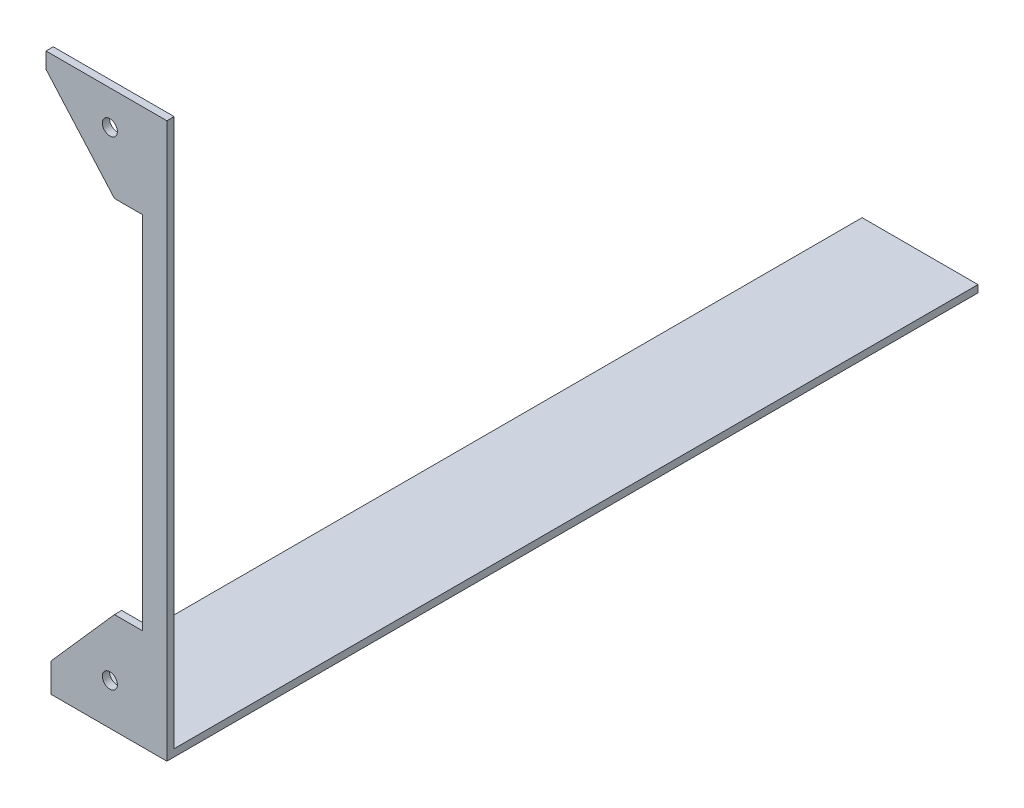
ISO-10303-21;
HEADER;
FILE_DESCRIPTION(('STEP AP214'),'2;1');
FILE_NAME('part.step','',(''),(''),'','','');
FILE_SCHEMA(('AUTOMOTIVE_DESIGN { 1 0 10303 214 1 1 1 1 }'));
ENDSEC;
DATA;
#1=APPLICATION_CONTEXT('core data for automotive mechanical design processes');
#2=APPLICATION_PROTOCOL_DEFINITION('international standard','automotive_design',2000,#1);
#3=PRODUCT_CONTEXT('',#1,'mechanical');
#4=PRODUCT('Part','Part','',(#3));
#5=PRODUCT_RELATED_PRODUCT_CATEGORY('part','',(#4));
#6=PRODUCT_DEFINITION_FORMATION('','',#4);
#7=PRODUCT_DEFINITION_CONTEXT('part definition',#1,'design');
#8=PRODUCT_DEFINITION('design','',#6,#7);
#9=PRODUCT_DEFINITION_SHAPE('','',#8);
#10=(LENGTH_UNIT() NAMED_UNIT(*) SI_UNIT(.MILLI.,.METRE.));
#11=(NAMED_UNIT(*) PLANE_ANGLE_UNIT() SI_UNIT($,.RADIAN.));
#12=(NAMED_UNIT(*) SI_UNIT($,.STERADIAN.) SOLID_ANGLE_UNIT());
#13=UNCERTAINTY_MEASURE_WITH_UNIT(LENGTH_MEASURE(1.E-05),#10,'distance_accuracy_value','');
#14=(GEOMETRIC_REPRESENTATION_CONTEXT(3) GLOBAL_UNCERTAINTY_ASSIGNED_CONTEXT((#13)) GLOBAL_UNIT_ASSIGNED_CONTEXT((#10,
#11,#12)) REPRESENTATION_CONTEXT('',''));
#15=CARTESIAN_POINT('',(0.,0.,0.));
#16=DIRECTION('',(0.,0.,1.));
#17=DIRECTION('',(1.,0.,0.));
#18=AXIS2_PLACEMENT_3D('',#15,#16,#17);
#19=CARTESIAN_POINT('',(-16.6361867704281,14.6789883268482,1.5875));
#20=DIRECTION('',(0.749837855365091,-0.661621637086848,0.));
#21=DIRECTION('',(0.661621637086848,0.749837855365091,0.));
#22=AXIS2_PLACEMENT_3D('',#19,#20,#21);
#23=PLANE('',#22);
#24=DIRECTION('',(-0.661621637086849,-0.749837855365093,0.));
#25=VECTOR('',#24,1.);
#26=CARTESIAN_POINT('',(-16.6361867704281,14.6789883268482,0.));
#27=LINE('',#26,#25);
#28=CARTESIAN_POINT('',(-11.5,20.5,0.));
#29=VERTEX_POINT('',#28);
#30=CARTESIAN_POINT('',(-25.4000000000002,4.74666666666666,0.));
#31=VERTEX_POINT('',#30);
#32=EDGE_CURVE('E151',#29,#31,#27,.T.);
#33=ORIENTED_EDGE('',*,*,#32,.T.);
#34=DIRECTION('',(0.,0.,-1.));
#35=VECTOR('',#34,1.);
#36=CARTESIAN_POINT('',(-25.4000000000002,4.74666666666666,1.5875));
#37=LINE('',#36,#35);
#38=CARTESIAN_POINT('',(-25.4000000000002,4.74666666666666,1.5875));
#39=VERTEX_POINT('',#38);
#40=EDGE_CURVE('E11',#39,#31,#37,.T.);
#41=ORIENTED_EDGE('',*,*,#40,.F.);
#42=DIRECTION('',(-0.661621637086849,-0.749837855365093,0.));
#43=VECTOR('',#42,1.);
#44=CARTESIAN_POINT('',(-16.6361867704281,14.6789883268482,1.5875));
#45=LINE('',#44,#43);
#46=CARTESIAN_POINT('',(-11.5,20.5,1.5875));
#47=VERTEX_POINT('',#46);
#48=EDGE_CURVE('E212',#47,#39,#45,.T.);
#49=ORIENTED_EDGE('',*,*,#48,.F.);
#50=DIRECTION('',(0.,0.,-1.));
#51=VECTOR('',#50,1.);
#52=CARTESIAN_POINT('',(-11.5,20.5,1.5875));
#53=LINE('',#52,#51);
#54=EDGE_CURVE('E140',#47,#29,#53,.T.);
#55=ORIENTED_EDGE('',*,*,#54,.T.);
#56=EDGE_LOOP('',(#33,#41,#49,#55));
#57=FACE_BOUND('',#56,.T.);
#58=ADVANCED_FACE('F39',(#57),#23,.F.);
#59=CARTESIAN_POINT('',(-25.4000000000002,0.,1.5875));
#60=DIRECTION('',(1.,0.,0.));
#61=DIRECTION('',(0.,1.,0.));
#62=AXIS2_PLACEMENT_3D('',#59,#60,#61);
#63=PLANE('',#62);
#64=DIRECTION('',(0.,-1.,0.));
#65=VECTOR('',#64,1.);
#66=CARTESIAN_POINT('',(-25.4000000000002,0.,0.));
#67=LINE('',#66,#65);
#68=CARTESIAN_POINT('',(-25.4000000000002,0.,0.));
#69=VERTEX_POINT('',#68);
#70=EDGE_CURVE('E154',#31,#69,#67,.T.);
#71=ORIENTED_EDGE('',*,*,#70,.T.);
#72=DIRECTION('',(0.,0.,1.));
#73=VECTOR('',#72,1.);
#74=CARTESIAN_POINT('',(-25.4000000000002,0.,-176.2125));
#75=LINE('',#74,#73);
#76=CARTESIAN_POINT('',(-25.4000000000002,0.,-176.2125));
#77=VERTEX_POINT('',#76);
#78=EDGE_CURVE('E224',#77,#69,#75,.T.);
#79=ORIENTED_EDGE('',*,*,#78,.F.);
#80=DIRECTION('',(0.,1.,0.));
#81=VECTOR('',#80,1.);
#82=CARTESIAN_POINT('',(-25.4000000000002,-1.5875,-176.2125));
#83=LINE('',#82,#81);
#84=CARTESIAN_POINT('',(-25.4000000000002,-1.5875,-176.2125));
#85=VERTEX_POINT('',#84);
#86=EDGE_CURVE('E148',#85,#77,#83,.T.);
#87=ORIENTED_EDGE('',*,*,#86,.F.);
#88=DIRECTION('',(0.,0.,1.));
#89=VECTOR('',#88,1.);
#90=CARTESIAN_POINT('',(-25.4000000000002,-1.5875,-176.2125));
#91=LINE('',#90,#89);
#92=CARTESIAN_POINT('',(-25.4000000000002,-1.5875,1.5875));
#93=VERTEX_POINT('',#92);
#94=EDGE_CURVE('E221',#85,#93,#91,.T.);
#95=ORIENTED_EDGE('',*,*,#94,.T.);
#96=DIRECTION('',(0.,-1.,0.));
#97=VECTOR('',#96,1.);
#98=CARTESIAN_POINT('',(-25.4000000000002,0.,1.5875));
#99=LINE('',#98,#97);
#100=EDGE_CURVE('E103',#39,#93,#99,.T.);
#101=ORIENTED_EDGE('',*,*,#100,.F.);
#102=ORIENTED_EDGE('',*,*,#40,.T.);
#103=EDGE_LOOP('',(#71,#79,#87,#95,#101,#102));
#104=FACE_BOUND('',#103,.T.);
#105=ADVANCED_FACE('F252',(#104),#63,.F.);
#106=CARTESIAN_POINT('',(0.,0.,1.5875));
#107=DIRECTION('',(1.,0.,0.));
#108=DIRECTION('',(0.,1.,0.));
#109=AXIS2_PLACEMENT_3D('',#106,#107,#108);
#110=PLANE('',#109);
#111=DIRECTION('',(0.,-1.,0.));
#112=VECTOR('',#111,1.);
#113=CARTESIAN_POINT('',(0.,0.,0.));
#114=LINE('',#113,#112);
#115=CARTESIAN_POINT('',(0.,120.,0.));
#116=VERTEX_POINT('',#115);
#117=CARTESIAN_POINT('',(0.,0.,0.));
#118=VERTEX_POINT('',#117);
#119=EDGE_CURVE('E160',#116,#118,#114,.T.);
#120=ORIENTED_EDGE('',*,*,#119,.F.);
#121=DIRECTION('',(0.,0.,-1.));
#122=VECTOR('',#121,1.);
#123=CARTESIAN_POINT('',(0.,120.,1.5875));
#124=LINE('',#123,#122);
#125=CARTESIAN_POINT('',(0.,120.,1.5875));
#126=VERTEX_POINT('',#125);
#127=EDGE_CURVE('E48',#126,#116,#124,.T.);
#128=ORIENTED_EDGE('',*,*,#127,.F.);
#129=DIRECTION('',(0.,-1.,0.));
#130=VECTOR('',#129,1.);
#131=CARTESIAN_POINT('',(0.,0.,1.5875));
#132=LINE('',#131,#130);
#133=CARTESIAN_POINT('',(0.,-1.5875,1.5875));
#134=VERTEX_POINT('',#133);
#135=EDGE_CURVE('E206',#126,#134,#132,.T.);
#136=ORIENTED_EDGE('',*,*,#135,.T.);
#137=DIRECTION('',(0.,0.,-1.));
#138=VECTOR('',#137,1.);
#139=CARTESIAN_POINT('',(0.,-1.5875,1.5875));
#140=LINE('',#139,#138);
#141=CARTESIAN_POINT('',(0.,-1.5875,-176.2125));
#142=VERTEX_POINT('',#141);
#143=EDGE_CURVE('E235',#134,#142,#140,.T.);
#144=ORIENTED_EDGE('',*,*,#143,.T.);
#145=DIRECTION('',(0.,1.,0.));
#146=VECTOR('',#145,1.);
#147=CARTESIAN_POINT('',(0.,-1.5875,-176.2125));
#148=LINE('',#147,#146);
#149=CARTESIAN_POINT('',(0.,0.,-176.2125));
#150=VERTEX_POINT('',#149);
#151=EDGE_CURVE('E219',#142,#150,#148,.T.);
#152=ORIENTED_EDGE('',*,*,#151,.T.);
#153=DIRECTION('',(0.,0.,-1.));
#154=VECTOR('',#153,1.);
#155=CARTESIAN_POINT('',(0.,0.,1.5875));
#156=LINE('',#155,#154);
#157=EDGE_CURVE('E195',#118,#150,#156,.T.);
#158=ORIENTED_EDGE('',*,*,#157,.F.);
#159=EDGE_LOOP('',(#120,#128,#136,#144,#152,#158));
#160=FACE_BOUND('',#159,.T.);
#161=ADVANCED_FACE('F192',(#160),#110,.T.);
#162=CARTESIAN_POINT('',(0.,120.,1.5875));
#163=DIRECTION('',(0.,1.,0.));
#164=DIRECTION('',(-1.,0.,0.));
#165=AXIS2_PLACEMENT_3D('',#162,#163,#164);
#166=PLANE('',#165);
#167=DIRECTION('',(1.00000000000001,0.,0.));
#168=VECTOR('',#167,1.);
#169=CARTESIAN_POINT('',(0.,120.,0.));
#170=LINE('',#169,#168);
#171=CARTESIAN_POINT('',(-26.5000000000002,120.,0.));
#172=VERTEX_POINT('',#171);
#173=EDGE_CURVE('E163',#172,#116,#170,.T.);
#174=ORIENTED_EDGE('',*,*,#173,.F.);
#175=DIRECTION('',(0.,0.,-1.));
#176=VECTOR('',#175,1.);
#177=CARTESIAN_POINT('',(-26.5000000000002,120.,1.5875));
#178=LINE('',#177,#176);
#179=CARTESIAN_POINT('',(-26.5000000000002,120.,1.5875));
#180=VERTEX_POINT('',#179);
#181=EDGE_CURVE('E180',#180,#172,#178,.T.);
#182=ORIENTED_EDGE('',*,*,#181,.F.);
#183=DIRECTION('',(1.00000000000001,0.,0.));
#184=VECTOR('',#183,1.);
#185=CARTESIAN_POINT('',(0.,120.,1.5875));
#186=LINE('',#185,#184);
#187=EDGE_CURVE('E187',#180,#126,#186,.T.);
#188=ORIENTED_EDGE('',*,*,#187,.T.);
#189=ORIENTED_EDGE('',*,*,#127,.T.);
#190=EDGE_LOOP('',(#174,#182,#188,#189));
#191=FACE_BOUND('',#190,.T.);
#192=ADVANCED_FACE('F185',(#191),#166,.T.);
#193=CARTESIAN_POINT('',(-26.5000000000003,0.,1.5875));
#194=DIRECTION('',(-1.,0.,0.));
#195=DIRECTION('',(0.,-1.,0.));
#196=AXIS2_PLACEMENT_3D('',#193,#194,#195);
#197=PLANE('',#196);
#198=DIRECTION('',(0.,1.,0.));
#199=VECTOR('',#198,1.);
#200=CARTESIAN_POINT('',(-26.5000000000003,0.,0.));
#201=LINE('',#200,#199);
#202=CARTESIAN_POINT('',(-26.5000000000002,116.5,0.));
#203=VERTEX_POINT('',#202);
#204=EDGE_CURVE('E166',#203,#172,#201,.T.);
#205=ORIENTED_EDGE('',*,*,#204,.F.);
#206=DIRECTION('',(0.,0.,-1.));
#207=VECTOR('',#206,1.);
#208=CARTESIAN_POINT('',(-26.5000000000002,116.5,1.5875));
#209=LINE('',#208,#207);
#210=CARTESIAN_POINT('',(-26.5000000000002,116.5,1.5875));
#211=VERTEX_POINT('',#210);
#212=EDGE_CURVE('E178',#211,#203,#209,.T.);
#213=ORIENTED_EDGE('',*,*,#212,.F.);
#214=DIRECTION('',(0.,1.,0.));
#215=VECTOR('',#214,1.);
#216=CARTESIAN_POINT('',(-26.5000000000003,0.,1.5875));
#217=LINE('',#216,#215);
#218=EDGE_CURVE('E204',#211,#180,#217,.T.);
#219=ORIENTED_EDGE('',*,*,#218,.T.);
#220=ORIENTED_EDGE('',*,*,#181,.T.);
#221=EDGE_LOOP('',(#205,#213,#219,#220));
#222=FACE_BOUND('',#221,.T.);
#223=ADVANCED_FACE('F202',(#222),#197,.T.);
#224=CARTESIAN_POINT('',(42.8968871595333,37.8501945525292,1.5875));
#225=DIRECTION('',(0.749837855365091,0.661621637086848,0.));
#226=DIRECTION('',(-0.661621637086848,0.749837855365091,0.));
#227=AXIS2_PLACEMENT_3D('',#224,#225,#226);
#228=PLANE('',#227);
#229=DIRECTION('',(0.661621637086849,-0.749837855365093,0.));
#230=VECTOR('',#229,1.);
#231=CARTESIAN_POINT('',(42.8968871595333,37.8501945525292,0.));
#232=LINE('',#231,#230);
#233=CARTESIAN_POINT('',(-11.5000000000001,99.5,0.));
#234=VERTEX_POINT('',#233);
#235=EDGE_CURVE('E169',#203,#234,#232,.T.);
#236=ORIENTED_EDGE('',*,*,#235,.T.);
#237=DIRECTION('',(0.,0.,-1.));
#238=VECTOR('',#237,1.);
#239=CARTESIAN_POINT('',(-11.5000000000001,99.5,1.5875));
#240=LINE('',#239,#238);
#241=CARTESIAN_POINT('',(-11.5000000000001,99.5,1.5875));
#242=VERTEX_POINT('',#241);
#243=EDGE_CURVE('E135',#242,#234,#240,.T.);
#244=ORIENTED_EDGE('',*,*,#243,.F.);
#245=DIRECTION('',(0.661621637086849,-0.749837855365093,0.));
#246=VECTOR('',#245,1.);
#247=CARTESIAN_POINT('',(42.8968871595333,37.8501945525292,1.5875));
#248=LINE('',#247,#246);
#249=EDGE_CURVE('E126',#211,#242,#248,.T.);
#250=ORIENTED_EDGE('',*,*,#249,.F.);
#251=ORIENTED_EDGE('',*,*,#212,.T.);
#252=EDGE_LOOP('',(#236,#244,#250,#251));
#253=FACE_BOUND('',#252,.T.);
#254=ADVANCED_FACE('F380',(#253),#228,.F.);
#255=CARTESIAN_POINT('',(0.,99.5,1.5875));
#256=DIRECTION('',(0.,1.,0.));
#257=DIRECTION('',(-1.,0.,0.));
#258=AXIS2_PLACEMENT_3D('',#255,#256,#257);
#259=PLANE('',#258);
#260=DIRECTION('',(1.00000000000001,0.,0.));
#261=VECTOR('',#260,1.);
#262=CARTESIAN_POINT('',(0.,99.5,0.));
#263=LINE('',#262,#261);
#264=CARTESIAN_POINT('',(-5.40000000000002,99.5,0.));
#265=VERTEX_POINT('',#264);
#266=EDGE_CURVE('E134',#234,#265,#263,.T.);
#267=ORIENTED_EDGE('',*,*,#266,.T.);
#268=DIRECTION('',(0.,0.,-1.));
#269=VECTOR('',#268,1.);
#270=CARTESIAN_POINT('',(-5.40000000000002,99.5,1.5875));
#271=LINE('',#270,#269);
#272=CARTESIAN_POINT('',(-5.40000000000002,99.5,1.5875));
#273=VERTEX_POINT('',#272);
#274=EDGE_CURVE('E131',#273,#265,#271,.T.);
#275=ORIENTED_EDGE('',*,*,#274,.F.);
#276=DIRECTION('',(1.00000000000001,0.,0.));
#277=VECTOR('',#276,1.);
#278=CARTESIAN_POINT('',(0.,99.5,1.5875));
#279=LINE('',#278,#277);
#280=EDGE_CURVE('E119',#242,#273,#279,.T.);
#281=ORIENTED_EDGE('',*,*,#280,.F.);
#282=ORIENTED_EDGE('',*,*,#243,.T.);
#283=EDGE_LOOP('',(#267,#275,#281,#282));
#284=FACE_BOUND('',#283,.T.);
#285=ADVANCED_FACE('F132',(#284),#259,.F.);
#286=CARTESIAN_POINT('',(-5.40000000000002,0.,1.5875));
#287=DIRECTION('',(1.,0.,0.));
#288=DIRECTION('',(0.,1.,0.));
#289=AXIS2_PLACEMENT_3D('',#286,#287,#288);
#290=PLANE('',#289);
#291=DIRECTION('',(0.,-1.,0.));
#292=VECTOR('',#291,1.);
#293=CARTESIAN_POINT('',(-5.40000000000002,0.,0.));
#294=LINE('',#293,#292);
#295=CARTESIAN_POINT('',(-5.40000000000002,20.5,0.));
#296=VERTEX_POINT('',#295);
#297=EDGE_CURVE('E89',#265,#296,#294,.T.);
#298=ORIENTED_EDGE('',*,*,#297,.T.);
#299=DIRECTION('',(0.,0.,-1.));
#300=VECTOR('',#299,1.);
#301=CARTESIAN_POINT('',(-5.40000000000002,20.5,1.5875));
#302=LINE('',#301,#300);
#303=CARTESIAN_POINT('',(-5.40000000000002,20.5,1.5875));
#304=VERTEX_POINT('',#303);
#305=EDGE_CURVE('E136',#304,#296,#302,.T.);
#306=ORIENTED_EDGE('',*,*,#305,.F.);
#307=DIRECTION('',(0.,-1.,0.));
#308=VECTOR('',#307,1.);
#309=CARTESIAN_POINT('',(-5.40000000000002,0.,1.5875));
#310=LINE('',#309,#308);
#311=EDGE_CURVE('E123',#273,#304,#310,.T.);
#312=ORIENTED_EDGE('',*,*,#311,.F.);
#313=ORIENTED_EDGE('',*,*,#274,.T.);
#314=EDGE_LOOP('',(#298,#306,#312,#313));
#315=FACE_BOUND('',#314,.T.);
#316=ADVANCED_FACE('F138',(#315),#290,.F.);
#317=CARTESIAN_POINT('',(-12.5000000000001,112.5,1.5875));
#318=DIRECTION('',(0.,0.,-1.));
#319=DIRECTION('',(-1.,0.,0.));
#320=AXIS2_PLACEMENT_3D('',#317,#318,#319);
#321=CYLINDRICAL_SURFACE('',#320,1.65);
#322=CARTESIAN_POINT('',(-12.5000000000001,112.5,1.5875));
#323=DIRECTION('',(0.,0.,1.00000000000001));
#324=DIRECTION('',(1.00000000000001,0.,0.));
#325=AXIS2_PLACEMENT_3D('',#322,#323,#324);
#326=CIRCLE('',#325,1.65);
#327=CARTESIAN_POINT('',(-10.8500000000001,112.5,1.5875));
#328=VERTEX_POINT('',#327);
#329=EDGE_CURVE('E214',#328,#328,#326,.T.);
#330=ORIENTED_EDGE('',*,*,#329,.T.);
#331=EDGE_LOOP('',(#330));
#332=FACE_BOUND('',#331,.T.);
#333=CARTESIAN_POINT('',(-12.5000000000001,112.5,0.));
#334=DIRECTION('',(0.,0.,1.00000000000001));
#335=DIRECTION('',(1.00000000000001,0.,0.));
#336=AXIS2_PLACEMENT_3D('',#333,#334,#335);
#337=CIRCLE('',#336,1.65);
#338=CARTESIAN_POINT('',(-10.8500000000001,112.5,0.));
#339=VERTEX_POINT('',#338);
#340=EDGE_CURVE('E147',#339,#339,#337,.T.);
#341=ORIENTED_EDGE('',*,*,#340,.F.);
#342=EDGE_LOOP('',(#341));
#343=FACE_BOUND('',#342,.T.);
#344=ADVANCED_FACE('F278',(#332,#343),#321,.F.);
#345=CARTESIAN_POINT('',(-12.5000000000001,7.49999999999999,1.5875));
#346=DIRECTION('',(0.,0.,-1.));
#347=DIRECTION('',(-1.,0.,0.));
#348=AXIS2_PLACEMENT_3D('',#345,#346,#347);
#349=CYLINDRICAL_SURFACE('',#348,1.65);
#350=CARTESIAN_POINT('',(-12.5000000000001,7.49999999999999,1.5875));
#351=DIRECTION('',(0.,0.,1.00000000000001));
#352=DIRECTION('',(1.00000000000001,0.,0.));
#353=AXIS2_PLACEMENT_3D('',#350,#351,#352);
#354=CIRCLE('',#353,1.65);
#355=CARTESIAN_POINT('',(-10.8500000000001,7.49999999999999,1.5875));
#356=VERTEX_POINT('',#355);
#357=EDGE_CURVE('E174',#356,#356,#354,.T.);
#358=ORIENTED_EDGE('',*,*,#357,.T.);
#359=EDGE_LOOP('',(#358));
#360=FACE_BOUND('',#359,.T.);
#361=CARTESIAN_POINT('',(-12.5000000000001,7.49999999999999,0.));
#362=DIRECTION('',(0.,0.,1.00000000000001));
#363=DIRECTION('',(1.00000000000001,0.,0.));
#364=AXIS2_PLACEMENT_3D('',#361,#362,#363);
#365=CIRCLE('',#364,1.65);
#366=CARTESIAN_POINT('',(-10.8500000000001,7.49999999999999,0.));
#367=VERTEX_POINT('',#366);
#368=EDGE_CURVE('E144',#367,#367,#365,.T.);
#369=ORIENTED_EDGE('',*,*,#368,.F.);
#370=EDGE_LOOP('',(#369));
#371=FACE_BOUND('',#370,.T.);
#372=ADVANCED_FACE('F41',(#360,#371),#349,.F.);
#373=CARTESIAN_POINT('',(0.,20.5,1.5875));
#374=DIRECTION('',(0.,-1.,0.));
#375=DIRECTION('',(1.,0.,0.));
#376=AXIS2_PLACEMENT_3D('',#373,#374,#375);
#377=PLANE('',#376);
#378=DIRECTION('',(-1.00000000000001,0.,0.));
#379=VECTOR('',#378,1.);
#380=CARTESIAN_POINT('',(0.,20.5,0.));
#381=LINE('',#380,#379);
#382=EDGE_CURVE('E95',#296,#29,#381,.T.);
#383=ORIENTED_EDGE('',*,*,#382,.T.);
#384=ORIENTED_EDGE('',*,*,#54,.F.);
#385=DIRECTION('',(-1.00000000000001,0.,0.));
#386=VECTOR('',#385,1.);
#387=CARTESIAN_POINT('',(0.,20.5,1.5875));
#388=LINE('',#387,#386);
#389=EDGE_CURVE('E56',#304,#47,#388,.T.);
#390=ORIENTED_EDGE('',*,*,#389,.F.);
#391=ORIENTED_EDGE('',*,*,#305,.T.);
#392=EDGE_LOOP('',(#383,#384,#390,#391));
#393=FACE_BOUND('',#392,.T.);
#394=ADVANCED_FACE('F268',(#393),#377,.F.);
#395=CARTESIAN_POINT('',(0.,0.,1.5875));
#396=DIRECTION('',(0.,0.,1.00000000000001));
#397=DIRECTION('',(1.00000000000001,0.,0.));
#398=AXIS2_PLACEMENT_3D('',#395,#396,#397);
#399=PLANE('',#398);
#400=ORIENTED_EDGE('',*,*,#357,.F.);
#401=EDGE_LOOP('',(#400));
#402=FACE_BOUND('',#401,.T.);
#403=ORIENTED_EDGE('',*,*,#329,.F.);
#404=EDGE_LOOP('',(#403));
#405=FACE_BOUND('',#404,.T.);
#406=ORIENTED_EDGE('',*,*,#48,.T.);
#407=ORIENTED_EDGE('',*,*,#100,.T.);
#408=DIRECTION('',(1.,0.,0.));
#409=VECTOR('',#408,1.);
#410=CARTESIAN_POINT('',(0.,-1.5875,1.5875));
#411=LINE('',#410,#409);
#412=EDGE_CURVE('E226',#93,#134,#411,.T.);
#413=ORIENTED_EDGE('',*,*,#412,.T.);
#414=ORIENTED_EDGE('',*,*,#135,.F.);
#415=ORIENTED_EDGE('',*,*,#187,.F.);
#416=ORIENTED_EDGE('',*,*,#218,.F.);
#417=ORIENTED_EDGE('',*,*,#249,.T.);
#418=ORIENTED_EDGE('',*,*,#280,.T.);
#419=ORIENTED_EDGE('',*,*,#311,.T.);
#420=ORIENTED_EDGE('',*,*,#389,.T.);
#421=EDGE_LOOP('',(#406,#407,#413,#414,#415,#416,#417,#418,#419,#420));
#422=FACE_BOUND('',#421,.T.);
#423=ADVANCED_FACE('F121',(#402,#405,#422),#399,.T.);
#424=CARTESIAN_POINT('',(0.,0.,0.));
#425=DIRECTION('',(0.,0.,1.00000000000001));
#426=DIRECTION('',(1.00000000000001,0.,0.));
#427=AXIS2_PLACEMENT_3D('',#424,#425,#426);
#428=PLANE('',#427);
#429=ORIENTED_EDGE('',*,*,#368,.T.);
#430=EDGE_LOOP('',(#429));
#431=FACE_BOUND('',#430,.T.);
#432=ORIENTED_EDGE('',*,*,#340,.T.);
#433=EDGE_LOOP('',(#432));
#434=FACE_BOUND('',#433,.T.);
#435=ORIENTED_EDGE('',*,*,#32,.F.);
#436=ORIENTED_EDGE('',*,*,#382,.F.);
#437=ORIENTED_EDGE('',*,*,#297,.F.);
#438=ORIENTED_EDGE('',*,*,#266,.F.);
#439=ORIENTED_EDGE('',*,*,#235,.F.);
#440=ORIENTED_EDGE('',*,*,#204,.T.);
#441=ORIENTED_EDGE('',*,*,#173,.T.);
#442=ORIENTED_EDGE('',*,*,#119,.T.);
#443=DIRECTION('',(-1.00000000000001,0.,0.));
#444=VECTOR('',#443,1.);
#445=CARTESIAN_POINT('',(0.,0.,0.));
#446=LINE('',#445,#444);
#447=EDGE_CURVE('E157',#118,#69,#446,.T.);
#448=ORIENTED_EDGE('',*,*,#447,.T.);
#449=ORIENTED_EDGE('',*,*,#70,.F.);
#450=EDGE_LOOP('',(#435,#436,#437,#438,#439,#440,#441,#442,#448,#449));
#451=FACE_BOUND('',#450,.T.);
#452=ADVANCED_FACE('F198',(#431,#434,#451),#428,.F.);
#453=CARTESIAN_POINT('',(0.,0.,0.));
#454=DIRECTION('',(0.,1.,0.));
#455=DIRECTION('',(0.,0.,1.));
#456=AXIS2_PLACEMENT_3D('',#453,#454,#455);
#457=PLANE('',#456);
#458=ORIENTED_EDGE('',*,*,#447,.F.);
#459=ORIENTED_EDGE('',*,*,#157,.T.);
#460=DIRECTION('',(-1.,0.,0.));
#461=VECTOR('',#460,1.);
#462=CARTESIAN_POINT('',(0.,0.,-176.2125));
#463=LINE('',#462,#461);
#464=EDGE_CURVE('E227',#150,#77,#463,.T.);
#465=ORIENTED_EDGE('',*,*,#464,.T.);
#466=ORIENTED_EDGE('',*,*,#78,.T.);
#467=EDGE_LOOP('',(#458,#459,#465,#466));
#468=FACE_BOUND('',#467,.T.);
#469=ADVANCED_FACE('F264',(#468),#457,.T.);
#470=CARTESIAN_POINT('',(0.,-1.5875,-176.2125));
#471=DIRECTION('',(0.,0.,-1.));
#472=DIRECTION('',(-1.,0.,0.));
#473=AXIS2_PLACEMENT_3D('',#470,#471,#472);
#474=PLANE('',#473);
#475=ORIENTED_EDGE('',*,*,#464,.F.);
#476=ORIENTED_EDGE('',*,*,#151,.F.);
#477=DIRECTION('',(-1.,0.,0.));
#478=VECTOR('',#477,1.);
#479=CARTESIAN_POINT('',(0.,-1.5875,-176.2125));
#480=LINE('',#479,#478);
#481=EDGE_CURVE('E232',#142,#85,#480,.T.);
#482=ORIENTED_EDGE('',*,*,#481,.T.);
#483=ORIENTED_EDGE('',*,*,#86,.T.);
#484=EDGE_LOOP('',(#475,#476,#482,#483));
#485=FACE_BOUND('',#484,.T.);
#486=ADVANCED_FACE('F258',(#485),#474,.T.);
#487=CARTESIAN_POINT('',(0.,-1.5875,0.));
#488=DIRECTION('',(0.,1.,0.));
#489=DIRECTION('',(0.,0.,1.));
#490=AXIS2_PLACEMENT_3D('',#487,#488,#489);
#491=PLANE('',#490);
#492=ORIENTED_EDGE('',*,*,#412,.F.);
#493=ORIENTED_EDGE('',*,*,#94,.F.);
#494=ORIENTED_EDGE('',*,*,#481,.F.);
#495=ORIENTED_EDGE('',*,*,#143,.F.);
#496=EDGE_LOOP('',(#492,#493,#494,#495));
#497=FACE_BOUND('',#496,.T.);
#498=ADVANCED_FACE('F247',(#497),#491,.F.);
#499=CLOSED_SHELL('',(#58,#105,#161,#192,#223,#254,#285,#316,#344,#372,#394,#423,#452,#469,#486,#498));
#500=MANIFOLD_SOLID_BREP('B2',#499);
#501=ADVANCED_BREP_SHAPE_REPRESENTATION('',(#18,#500),#14);
#502=SHAPE_DEFINITION_REPRESENTATION(#9,#501);
ENDSEC;
END-ISO-10303-21;
